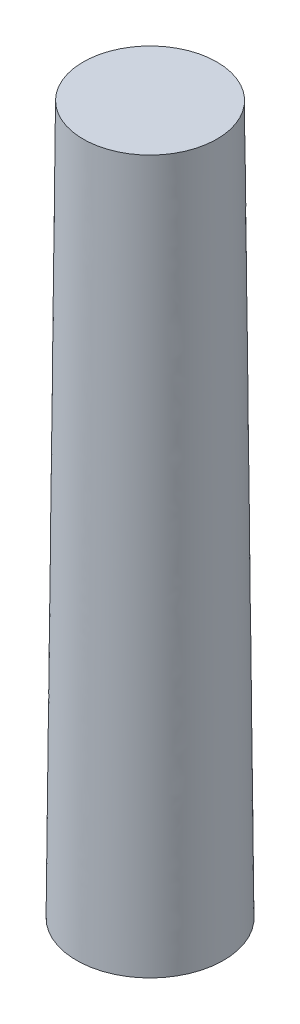
ISO-10303-21;
HEADER;
FILE_DESCRIPTION(('STEP AP214'),'2;1');
FILE_NAME('part.step','',(''),(''),'','','');
FILE_SCHEMA(('AUTOMOTIVE_DESIGN { 1 0 10303 214 1 1 1 1 }'));
ENDSEC;
DATA;
#1=APPLICATION_CONTEXT('core data for automotive mechanical design processes');
#2=APPLICATION_PROTOCOL_DEFINITION('international standard','automotive_design',2000,#1);
#3=PRODUCT_CONTEXT('',#1,'mechanical');
#4=PRODUCT('Part','Part','',(#3));
#5=PRODUCT_RELATED_PRODUCT_CATEGORY('part','',(#4));
#6=PRODUCT_DEFINITION_FORMATION('','',#4);
#7=PRODUCT_DEFINITION_CONTEXT('part definition',#1,'design');
#8=PRODUCT_DEFINITION('design','',#6,#7);
#9=PRODUCT_DEFINITION_SHAPE('','',#8);
#10=(LENGTH_UNIT() NAMED_UNIT(*) SI_UNIT(.MILLI.,.METRE.));
#11=(NAMED_UNIT(*) PLANE_ANGLE_UNIT() SI_UNIT($,.RADIAN.));
#12=(NAMED_UNIT(*) SI_UNIT($,.STERADIAN.) SOLID_ANGLE_UNIT());
#13=UNCERTAINTY_MEASURE_WITH_UNIT(LENGTH_MEASURE(1.E-05),#10,'distance_accuracy_value','');
#14=(GEOMETRIC_REPRESENTATION_CONTEXT(3) GLOBAL_UNCERTAINTY_ASSIGNED_CONTEXT((#13)) GLOBAL_UNIT_ASSIGNED_CONTEXT((#10,
#11,#12)) REPRESENTATION_CONTEXT('',''));
#15=CARTESIAN_POINT('',(0.,0.,0.));
#16=DIRECTION('',(0.,0.,1.));
#17=DIRECTION('',(1.,0.,0.));
#18=AXIS2_PLACEMENT_3D('',#15,#16,#17);
#19=CARTESIAN_POINT('',(0.,0.,0.));
#20=DIRECTION('',(0.,1.,0.));
#21=DIRECTION('',(0.,0.,1.));
#22=AXIS2_PLACEMENT_3D('',#19,#20,#21);
#23=PLANE('',#22);
#24=CARTESIAN_POINT('',(0.,0.,0.));
#25=DIRECTION('',(0.,1.,0.));
#26=DIRECTION('',(0.,0.,1.));
#27=AXIS2_PLACEMENT_3D('',#24,#25,#26);
#28=CIRCLE('',#27,9.35);
#29=CARTESIAN_POINT('',(0.,0.,-9.35));
#30=VERTEX_POINT('',#29);
#31=EDGE_CURVE('E12',#30,#30,#28,.T.);
#32=ORIENTED_EDGE('',*,*,#31,.F.);
#33=EDGE_LOOP('',(#32));
#34=FACE_BOUND('',#33,.T.);
#35=ADVANCED_FACE('F51',(#34),#23,.F.);
#36=CARTESIAN_POINT('',(0.,90.,0.));
#37=DIRECTION('',(0.,1.,0.));
#38=DIRECTION('',(0.,0.,1.));
#39=AXIS2_PLACEMENT_3D('',#36,#37,#38);
#40=PLANE('',#39);
#41=CARTESIAN_POINT('',(0.,90.,0.));
#42=DIRECTION('',(0.,1.,0.));
#43=DIRECTION('',(0.,0.,1.));
#44=AXIS2_PLACEMENT_3D('',#41,#42,#43);
#45=CIRCLE('',#44,8.5);
#46=CARTESIAN_POINT('',(0.,90.,-8.5));
#47=VERTEX_POINT('',#46);
#48=EDGE_CURVE('E59',#47,#47,#45,.T.);
#49=ORIENTED_EDGE('',*,*,#48,.T.);
#50=EDGE_LOOP('',(#49));
#51=FACE_BOUND('',#50,.T.);
#52=ADVANCED_FACE('F83',(#51),#40,.T.);
#53=CARTESIAN_POINT('',(0.,90.,-8.5));
#54=CARTESIAN_POINT('',(0.,60.,-8.78333333333333));
#55=CARTESIAN_POINT('',(0.,30.,-9.06666666666666));
#56=CARTESIAN_POINT('',(0.,0.,-9.35));
#57=CARTESIAN_POINT('',(0.234563879217319,90.,-8.5));
#58=CARTESIAN_POINT('',(0.242382675191229,60.,-8.78333333333333));
#59=CARTESIAN_POINT('',(0.25020147116514,30.,-9.06666666666666));
#60=CARTESIAN_POINT('',(0.258020267139051,0.,-9.35));
#61=CARTESIAN_POINT('',(0.699278861808489,90.,-8.48095638792173));
#62=CARTESIAN_POINT('',(0.722588157202105,60.,-8.76365493418579));
#63=CARTESIAN_POINT('',(0.745897452595721,30.,-9.04635348044985));
#64=CARTESIAN_POINT('',(0.769206747989338,0.,-9.3290520267139));
#65=CARTESIAN_POINT('',(1.38091838272964,90.,-8.39745475900475));
#66=CARTESIAN_POINT('',(1.42694899548729,60.,-8.67736991763824));
#67=CARTESIAN_POINT('',(1.47297960824495,30.,-8.95728507627173));
#68=CARTESIAN_POINT('',(1.5190102210026,0.,-9.23720023490522));
#69=CARTESIAN_POINT('',(2.04493032524995,90.,-8.2612115447234));
#70=CARTESIAN_POINT('',(2.11309466942495,60.,-8.53658526288084));
#71=CARTESIAN_POINT('',(2.18125901359995,30.,-8.81195898103829));
#72=CARTESIAN_POINT('',(2.24942335777495,0.,-9.08733269919573));
#73=CARTESIAN_POINT('',(5.91006875735552,90.,-7.14047049946044));
#74=CARTESIAN_POINT('',(6.10707104926737,60.,-7.37848618277579));
#75=CARTESIAN_POINT('',(6.30407334117923,30.,-7.61650186609113));
#76=CARTESIAN_POINT('',(6.50107563309107,0.,-7.85451754940648));
#77=CARTESIAN_POINT('',(8.5,90.,-3.75302206747708));
#78=CARTESIAN_POINT('',(8.78333333333333,60.,-3.87812280305965));
#79=CARTESIAN_POINT('',(9.06666666666667,30.,-4.00322353864222));
#80=CARTESIAN_POINT('',(9.35,0.,-4.12832427422478));
#81=CARTESIAN_POINT('',(8.5,90.,4.69127758434635));
#82=CARTESIAN_POINT('',(8.78333333333333,60.,4.84765350382456));
#83=CARTESIAN_POINT('',(9.06666666666667,30.,5.00402942330278));
#84=CARTESIAN_POINT('',(9.35,0.,5.16040534278099));
#85=CARTESIAN_POINT('',(4.69127758434635,90.,8.5));
#86=CARTESIAN_POINT('',(4.84765350382456,60.,8.78333333333333));
#87=CARTESIAN_POINT('',(5.00402942330277,30.,9.06666666666667));
#88=CARTESIAN_POINT('',(5.16040534278098,0.,9.35));
#89=CARTESIAN_POINT('',(-4.69127758434635,90.,8.5));
#90=CARTESIAN_POINT('',(-4.84765350382456,60.,8.78333333333333));
#91=CARTESIAN_POINT('',(-5.00402942330278,30.,9.06666666666666));
#92=CARTESIAN_POINT('',(-5.16040534278099,0.,9.35));
#93=CARTESIAN_POINT('',(-8.5,90.,4.69127758434635));
#94=CARTESIAN_POINT('',(-8.78333333333333,60.,4.84765350382456));
#95=CARTESIAN_POINT('',(-9.06666666666667,30.,5.00402942330277));
#96=CARTESIAN_POINT('',(-9.35,0.,5.16040534278098));
#97=CARTESIAN_POINT('',(-8.5,90.,-3.75302206747708));
#98=CARTESIAN_POINT('',(-8.78333333333333,60.,-3.87812280305965));
#99=CARTESIAN_POINT('',(-9.06666666666666,30.,-4.00322353864222));
#100=CARTESIAN_POINT('',(-9.35,0.,-4.12832427422479));
#101=CARTESIAN_POINT('',(-5.91006875735552,90.,-7.14047049946044));
#102=CARTESIAN_POINT('',(-6.10707104926737,60.,-7.37848618277579));
#103=CARTESIAN_POINT('',(-6.30407334117922,30.,-7.61650186609114));
#104=CARTESIAN_POINT('',(-6.50107563309107,0.,-7.85451754940648));
#105=CARTESIAN_POINT('',(-2.04493032524995,90.,-8.2612115447234));
#106=CARTESIAN_POINT('',(-2.11309466942495,60.,-8.53658526288084));
#107=CARTESIAN_POINT('',(-2.18125901359994,30.,-8.81195898103829));
#108=CARTESIAN_POINT('',(-2.24942335777494,0.,-9.08733269919573));
#109=CARTESIAN_POINT('',(-1.38091838272963,90.,-8.39745475900475));
#110=CARTESIAN_POINT('',(-1.42694899548729,60.,-8.67736991763824));
#111=CARTESIAN_POINT('',(-1.47297960824494,30.,-8.95728507627173));
#112=CARTESIAN_POINT('',(-1.5190102210026,0.,-9.23720023490522));
#113=CARTESIAN_POINT('',(-0.699278861808487,90.,-8.48095638792173));
#114=CARTESIAN_POINT('',(-0.722588157202103,60.,-8.76365493418579));
#115=CARTESIAN_POINT('',(-0.745897452595719,30.,-9.04635348044985));
#116=CARTESIAN_POINT('',(-0.769206747989335,0.,-9.3290520267139));
#117=CARTESIAN_POINT('',(-0.234563879217315,90.,-8.5));
#118=CARTESIAN_POINT('',(-0.242382675191225,60.,-8.78333333333333));
#119=CARTESIAN_POINT('',(-0.250201471165136,30.,-9.06666666666666));
#120=CARTESIAN_POINT('',(-0.258020267139046,0.,-9.35));
#121=CARTESIAN_POINT('',(0.,90.,-8.5));
#122=CARTESIAN_POINT('',(0.,60.,-8.78333333333333));
#123=CARTESIAN_POINT('',(0.,30.,-9.06666666666666));
#124=CARTESIAN_POINT('',(0.,0.,-9.35));
#125=B_SPLINE_SURFACE_WITH_KNOTS('',3,3,((#53,#54,#55,#56),(#57,#58,#59,#60),(#61,#62,#63,#64),
(#65,#66,#67,#68),(#69,#70,#71,#72),(#73,#74,#75,#76),(#77,#78,#79,#80),(#81,#82,#83,#84),(#85,
#86,#87,#88),(#89,#90,#91,#92),(#93,#94,#95,#96),(#97,#98,#99,#100),(#101,#102,#103,#104),(#105,
#106,#107,#108),(#109,#110,#111,#112),(#113,#114,#115,#116),(#117,#118,#119,#120),(#121,#122,
#123,#124)),.UNSPECIFIED.,.T.,.F.,.F.,(4,1,1,1,1,2,2,2,1,1,1,1,4),(4,4),(0.,0.0125,
0.0249999999999999,0.0375000000000001,0.05,0.25,0.5,0.75,0.95,0.9625,0.975,0.9875,1.),(0.,1.),.UNSPECIFIED.);
#126=CARTESIAN_POINT('',(0.,90.,-8.5));
#127=CARTESIAN_POINT('',(0.,89.0625,-8.50885416666667));
#128=CARTESIAN_POINT('',(0.,88.125,-8.51770833333333));
#129=CARTESIAN_POINT('',(0.,86.25,-8.53541666666667));
#130=CARTESIAN_POINT('',(0.,85.3125,-8.54427083333333));
#131=CARTESIAN_POINT('',(0.,83.4375,-8.56197916666667));
#132=CARTESIAN_POINT('',(0.,82.5,-8.57083333333333));
#133=CARTESIAN_POINT('',(0.,80.625,-8.58854166666667));
#134=CARTESIAN_POINT('',(0.,79.6875,-8.59739583333333));
#135=CARTESIAN_POINT('',(0.,77.8125,-8.61510416666667));
#136=CARTESIAN_POINT('',(0.,76.875,-8.62395833333333));
#137=CARTESIAN_POINT('',(0.,75.,-8.64166666666667));
#138=CARTESIAN_POINT('',(0.,74.0625,-8.65052083333333));
#139=CARTESIAN_POINT('',(0.,72.1875,-8.66822916666667));
#140=CARTESIAN_POINT('',(0.,71.25,-8.67708333333334));
#141=CARTESIAN_POINT('',(0.,69.375,-8.69479166666667));
#142=CARTESIAN_POINT('',(0.,68.4375,-8.70364583333333));
#143=CARTESIAN_POINT('',(0.,66.5625,-8.72135416666666));
#144=CARTESIAN_POINT('',(0.,65.625,-8.73020833333333));
#145=CARTESIAN_POINT('',(0.,63.75,-8.74791666666667));
#146=CARTESIAN_POINT('',(0.,62.8125,-8.75677083333333));
#147=CARTESIAN_POINT('',(0.,60.9375,-8.77447916666667));
#148=CARTESIAN_POINT('',(0.,60.,-8.78333333333333));
#149=CARTESIAN_POINT('',(0.,58.125,-8.80104166666666));
#150=CARTESIAN_POINT('',(0.,57.1875,-8.80989583333333));
#151=CARTESIAN_POINT('',(0.,55.3125,-8.82760416666667));
#152=CARTESIAN_POINT('',(0.,54.375,-8.83645833333333));
#153=CARTESIAN_POINT('',(0.,52.5,-8.85416666666666));
#154=CARTESIAN_POINT('',(0.,51.5625,-8.86302083333333));
#155=CARTESIAN_POINT('',(0.,49.6875,-8.88072916666666));
#156=CARTESIAN_POINT('',(0.,48.75,-8.88958333333333));
#157=CARTESIAN_POINT('',(0.,46.875,-8.90729166666667));
#158=CARTESIAN_POINT('',(0.,45.9375,-8.91614583333333));
#159=CARTESIAN_POINT('',(0.,44.0625,-8.93385416666667));
#160=CARTESIAN_POINT('',(0.,43.125,-8.94270833333333));
#161=CARTESIAN_POINT('',(0.,41.25,-8.96041666666667));
#162=CARTESIAN_POINT('',(0.,40.3125,-8.96927083333333));
#163=CARTESIAN_POINT('',(0.,38.4375,-8.98697916666666));
#164=CARTESIAN_POINT('',(0.,37.5,-8.99583333333333));
#165=CARTESIAN_POINT('',(0.,35.625,-9.01354166666666));
#166=CARTESIAN_POINT('',(0.,34.6875,-9.02239583333333));
#167=CARTESIAN_POINT('',(0.,32.8125,-9.04010416666667));
#168=CARTESIAN_POINT('',(0.,31.875,-9.04895833333333));
#169=CARTESIAN_POINT('',(0.,30.,-9.06666666666666));
#170=CARTESIAN_POINT('',(0.,29.0625,-9.07552083333333));
#171=CARTESIAN_POINT('',(0.,27.1875,-9.09322916666666));
#172=CARTESIAN_POINT('',(0.,26.25,-9.10208333333333));
#173=CARTESIAN_POINT('',(0.,24.375,-9.11979166666666));
#174=CARTESIAN_POINT('',(0.,23.4375,-9.12864583333333));
#175=CARTESIAN_POINT('',(0.,21.5625,-9.14635416666667));
#176=CARTESIAN_POINT('',(0.,20.625,-9.15520833333333));
#177=CARTESIAN_POINT('',(0.,18.75,-9.17291666666666));
#178=CARTESIAN_POINT('',(0.,17.8125,-9.18177083333333));
#179=CARTESIAN_POINT('',(0.,15.9375,-9.19947916666666));
#180=CARTESIAN_POINT('',(0.,15.,-9.20833333333333));
#181=CARTESIAN_POINT('',(0.,13.125,-9.22604166666666));
#182=CARTESIAN_POINT('',(0.,12.1875,-9.23489583333333));
#183=CARTESIAN_POINT('',(0.,10.3125,-9.25260416666666));
#184=CARTESIAN_POINT('',(0.,9.375,-9.26145833333333));
#185=CARTESIAN_POINT('',(0.,7.5,-9.27916666666666));
#186=CARTESIAN_POINT('',(0.,6.5625,-9.28802083333333));
#187=CARTESIAN_POINT('',(0.,4.6875,-9.30572916666667));
#188=CARTESIAN_POINT('',(0.,3.75,-9.31458333333333));
#189=CARTESIAN_POINT('',(0.,1.875,-9.33229166666666));
#190=CARTESIAN_POINT('',(0.,0.937499999999999,-9.34114583333333));
#191=CARTESIAN_POINT('',(0.,0.,-9.35));
#192=B_SPLINE_CURVE_WITH_KNOTS('',3,(#126,#127,#128,#129,#130,#131,#132,#133,#134,#135,#136,
#137,#138,#139,#140,#141,#142,#143,#144,#145,#146,#147,#148,#149,#150,#151,#152,#153,#154,#155,
#156,#157,#158,#159,#160,#161,#162,#163,#164,#165,#166,#167,#168,#169,#170,#171,#172,#173,#174,
#175,#176,#177,#178,#179,#180,#181,#182,#183,#184,#185,#186,#187,#188,#189,#190,#191),
.UNSPECIFIED.,.F.,.F.,(4,2,2,2,2,2,2,2,2,2,2,2,2,2,2,2,2,2,2,2,2,2,2,2,2,2,2,2,2,2,2,2,4),(0.,
2.81262543123078,5.62525086246161,8.4378762936924,11.2505017249232,14.063127156154,
16.8757525873848,19.6883780186156,22.5010034498464,25.3136288810772,28.126254312308,
30.9388797435388,33.7515051747696,36.5641306060004,39.3767560372312,42.189381468462,
45.0020068996928,47.8146323309236,50.6272577621544,53.4398831933852,56.252508624616,
59.0651340558468,61.8777594870776,64.6903849183085,67.5030103495393,70.3156357807701,
73.1282612120009,75.9408866432317,78.7535120744624,81.5661375056932,84.378762936924,
87.1913883681548,90.0040137993856),.UNSPECIFIED.);
#193=EDGE_CURVE('BSEAM91',#47,#30,#192,.T.);
#194=ORIENTED_EDGE('',*,*,#48,.F.);
#195=ORIENTED_EDGE('',*,*,#31,.T.);
#196=ORIENTED_EDGE('',*,*,#193,.T.);
#197=ORIENTED_EDGE('',*,*,#193,.F.);
#198=EDGE_LOOP('',(#194,#196,#195,#197));
#199=FACE_BOUND('',#198,.T.);
#200=ADVANCED_FACE('F91',(#199),#125,.T.);
#201=CLOSED_SHELL('',(#35,#52,#200));
#202=MANIFOLD_SOLID_BREP('B2',#201);
#203=ADVANCED_BREP_SHAPE_REPRESENTATION('',(#18,#202),#14);
#204=SHAPE_DEFINITION_REPRESENTATION(#9,#203);
ENDSEC;
END-ISO-10303-21;
